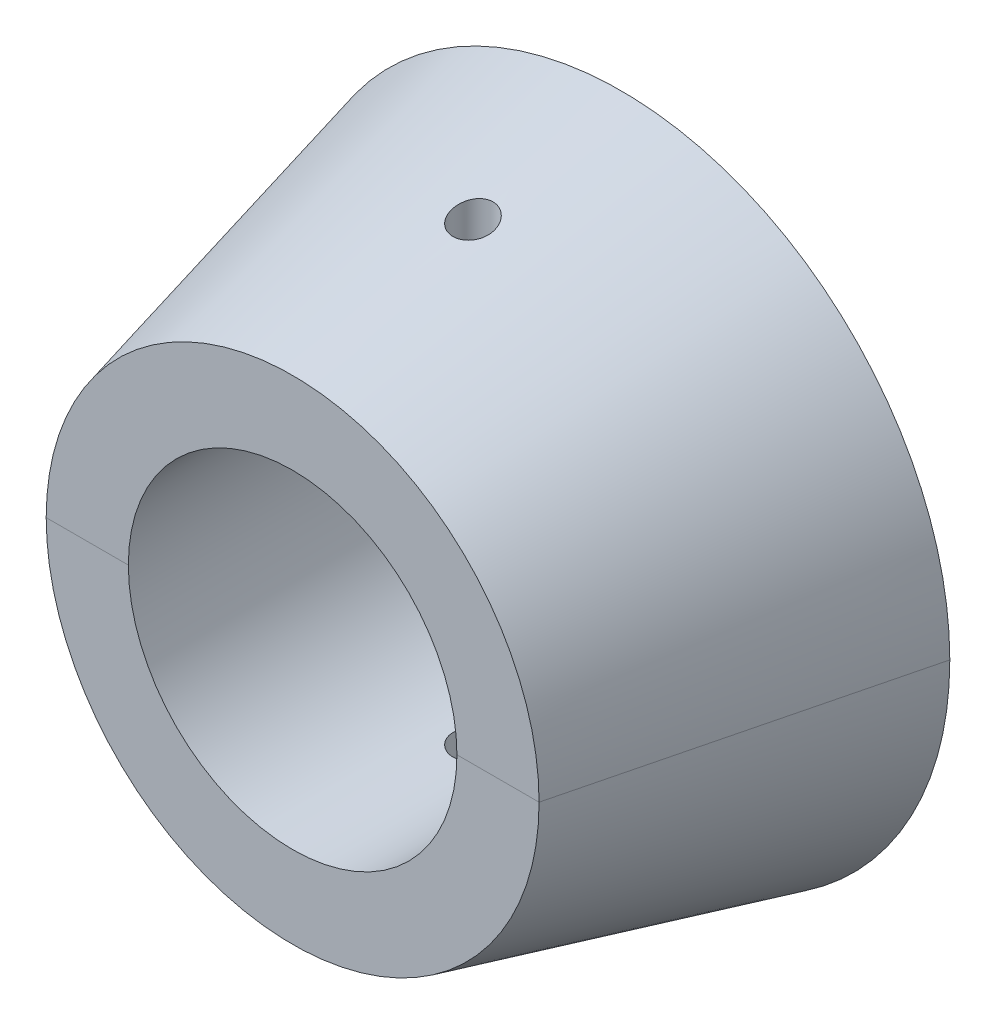
ISO-10303-21;
HEADER;
FILE_DESCRIPTION(('STEP AP214'),'2;1');
FILE_NAME('part.step','',(''),(''),'','','');
FILE_SCHEMA(('AUTOMOTIVE_DESIGN { 1 0 10303 214 1 1 1 1 }'));
ENDSEC;
DATA;
#1=APPLICATION_CONTEXT('core data for automotive mechanical design processes');
#2=APPLICATION_PROTOCOL_DEFINITION('international standard','automotive_design',2000,#1);
#3=PRODUCT_CONTEXT('',#1,'mechanical');
#4=PRODUCT('Part','Part','',(#3));
#5=PRODUCT_RELATED_PRODUCT_CATEGORY('part','',(#4));
#6=PRODUCT_DEFINITION_FORMATION('','',#4);
#7=PRODUCT_DEFINITION_CONTEXT('part definition',#1,'design');
#8=PRODUCT_DEFINITION('design','',#6,#7);
#9=PRODUCT_DEFINITION_SHAPE('','',#8);
#10=(LENGTH_UNIT() NAMED_UNIT(*) SI_UNIT(.MILLI.,.METRE.));
#11=(NAMED_UNIT(*) PLANE_ANGLE_UNIT() SI_UNIT($,.RADIAN.));
#12=(NAMED_UNIT(*) SI_UNIT($,.STERADIAN.) SOLID_ANGLE_UNIT());
#13=UNCERTAINTY_MEASURE_WITH_UNIT(LENGTH_MEASURE(1.E-05),#10,'distance_accuracy_value','');
#14=(GEOMETRIC_REPRESENTATION_CONTEXT(3) GLOBAL_UNCERTAINTY_ASSIGNED_CONTEXT((#13)) GLOBAL_UNIT_ASSIGNED_CONTEXT((#10,
#11,#12)) REPRESENTATION_CONTEXT('',''));
#15=CARTESIAN_POINT('',(0.,0.,0.));
#16=DIRECTION('',(0.,0.,1.));
#17=DIRECTION('',(1.,0.,0.));
#18=AXIS2_PLACEMENT_3D('',#15,#16,#17);
#19=CARTESIAN_POINT('',(0.,0.,5.));
#20=DIRECTION('',(0.,0.,-1.));
#21=DIRECTION('',(-1.,0.,0.));
#22=AXIS2_PLACEMENT_3D('',#19,#20,#21);
#23=CONICAL_SURFACE('',#22,20.,0.244978663126864);
#24=DIRECTION('',(-0.242535625036333,0.,0.970142500145332));
#25=VECTOR('',#24,1.);
#26=CARTESIAN_POINT('',(15.,0.,25.));
#27=LINE('',#26,#25);
#28=CARTESIAN_POINT('',(20.,0.,5.));
#29=VERTEX_POINT('',#28);
#30=CARTESIAN_POINT('',(15.,0.,25.));
#31=VERTEX_POINT('',#30);
#32=EDGE_CURVE('E159',#29,#31,#27,.T.);
#33=ORIENTED_EDGE('',*,*,#32,.T.);
#34=CARTESIAN_POINT('',(0.,0.,25.));
#35=DIRECTION('',(0.,0.,-1.));
#36=DIRECTION('',(1.,0.,0.));
#37=AXIS2_PLACEMENT_3D('',#34,#35,#36);
#38=CIRCLE('',#37,15.);
#39=CARTESIAN_POINT('',(-15.,0.,25.));
#40=VERTEX_POINT('',#39);
#41=EDGE_CURVE('E170',#31,#40,#38,.T.);
#42=ORIENTED_EDGE('',*,*,#41,.T.);
#43=DIRECTION('',(0.242535625036333,0.,0.970142500145332));
#44=VECTOR('',#43,1.);
#45=CARTESIAN_POINT('',(-15.,0.,25.));
#46=LINE('',#45,#44);
#47=CARTESIAN_POINT('',(-20.,0.,5.));
#48=VERTEX_POINT('',#47);
#49=EDGE_CURVE('E153',#48,#40,#46,.T.);
#50=ORIENTED_EDGE('',*,*,#49,.F.);
#51=CARTESIAN_POINT('',(0.,0.,5.));
#52=DIRECTION('',(0.,0.,-1.));
#53=DIRECTION('',(1.,0.,0.));
#54=AXIS2_PLACEMENT_3D('',#51,#52,#53);
#55=CIRCLE('',#54,20.);
#56=EDGE_CURVE('E173',#29,#48,#55,.T.);
#57=ORIENTED_EDGE('',*,*,#56,.F.);
#58=EDGE_LOOP('',(#33,#42,#50,#57));
#59=FACE_BOUND('',#58,.T.);
#60=CARTESIAN_POINT('',(3.,-16.1021359416428,19.4831280498653));
#61=CARTESIAN_POINT('',(3.,-16.4192333907019,18.2361816384219));
#62=CARTESIAN_POINT('',(3.,-16.7360422821651,16.9891618842602));
#63=CARTESIAN_POINT('',(3.,-17.3691612629189,14.4949959113051));
#64=CARTESIAN_POINT('',(3.,-17.6854713522684,13.2478496925266));
#65=CARTESIAN_POINT('',(3.,-18.3176711061729,10.7534507580422));
#66=CARTESIAN_POINT('',(3.,-18.633560770742,9.50619804233979));
#67=CARTESIAN_POINT('',(3.,-19.2649766184185,7.0116004495142));
#68=CARTESIAN_POINT('',(3.,-19.5805028014831,5.76425557238019));
#69=CARTESIAN_POINT('',(3.,-19.8958756729426,4.51687195013467));
#70=B_SPLINE_CURVE_WITH_KNOTS('',3,(#60,#61,#62,#63,#64,#65,#66,#67,#68,#69),.UNSPECIFIED.,.F.,
.F.,(4,2,2,2,4),(0.,3.85990085893771,7.71980126178377,11.5797015359117,15.4396022651384),.UNSPECIFIED.);
#71=CARTESIAN_POINT('',(3.,-17.4946420369209,14.));
#72=VERTEX_POINT('',#71);
#73=CARTESIAN_POINT('',(3.,-18.5084440188796,10.));
#74=VERTEX_POINT('',#73);
#75=EDGE_CURVE('E54',#72,#74,#70,.T.);
#76=ORIENTED_EDGE('',*,*,#75,.T.);
#77=CARTESIAN_POINT('',(0.,0.,10.));
#78=DIRECTION('',(0.,0.,1.));
#79=DIRECTION('',(1.,0.,0.));
#80=AXIS2_PLACEMENT_3D('',#77,#78,#79);
#81=CIRCLE('',#80,18.75);
#82=CARTESIAN_POINT('',(-3.,-18.5084440188796,10.));
#83=VERTEX_POINT('',#82);
#84=EDGE_CURVE('E11',#74,#83,#81,.F.);
#85=ORIENTED_EDGE('',*,*,#84,.T.);
#86=CARTESIAN_POINT('',(-3.,-16.1021359416428,19.4831280498653));
#87=CARTESIAN_POINT('',(-3.,-16.4192333907019,18.2361816384219));
#88=CARTESIAN_POINT('',(-3.,-16.7360422821651,16.9891618842602));
#89=CARTESIAN_POINT('',(-3.,-17.3691612629189,14.4949959113051));
#90=CARTESIAN_POINT('',(-3.,-17.6854713522684,13.2478496925266));
#91=CARTESIAN_POINT('',(-3.,-18.3176711061729,10.7534507580422));
#92=CARTESIAN_POINT('',(-3.,-18.633560770742,9.50619804233979));
#93=CARTESIAN_POINT('',(-3.,-19.2649766184185,7.0116004495142));
#94=CARTESIAN_POINT('',(-3.,-19.5805028014831,5.76425557238019));
#95=CARTESIAN_POINT('',(-3.,-19.8958756729426,4.51687195013467));
#96=B_SPLINE_CURVE_WITH_KNOTS('',3,(#86,#87,#88,#89,#90,#91,#92,#93,#94,#95),.UNSPECIFIED.,.F.,
.F.,(4,2,2,2,4),(0.,3.85990085893771,7.71980126178377,11.5797015359117,15.4396022651384),.UNSPECIFIED.);
#97=CARTESIAN_POINT('',(-3.,-17.4946420369209,14.));
#98=VERTEX_POINT('',#97);
#99=EDGE_CURVE('E186',#98,#83,#96,.T.);
#100=ORIENTED_EDGE('',*,*,#99,.F.);
#101=CARTESIAN_POINT('',(2.99999999333333,-17.4946927678796,13.9998));
#102=CARTESIAN_POINT('',(3.00001279711659,-17.4735359007503,14.0831829455452));
#103=CARTESIAN_POINT('',(2.99653455992637,-17.4529483122174,14.1667134548675));
#104=CARTESIAN_POINT('',(2.98257770875621,-17.4130381706139,14.3335029744372));
#105=CARTESIAN_POINT('',(2.97209811079381,-17.3937157957776,14.416761944869));
#106=CARTESIAN_POINT('',(2.94411682366012,-17.3564640460793,14.5824381597243));
#107=CARTESIAN_POINT('',(2.92661342533385,-17.3385350115379,14.6648551942638));
#108=CARTESIAN_POINT('',(2.88465362207424,-17.3041698190952,14.82818710329));
#109=CARTESIAN_POINT('',(2.86019767830832,-17.2877335622723,14.9091020770303));
#110=CARTESIAN_POINT('',(2.77643827539865,-17.2407167423689,15.1489187172725));
#111=CARTESIAN_POINT('',(2.70675824188497,-17.212448082004,15.3048027718332));
#112=CARTESIAN_POINT('',(2.54150237880649,-17.1622430856381,15.6030762527477));
#113=CARTESIAN_POINT('',(2.4459431054906,-17.1403027195776,15.7454742284811));
#114=CARTESIAN_POINT('',(2.23374360507002,-17.1026431557132,16.0095950883432));
#115=CARTESIAN_POINT('',(2.11758514094337,-17.0868036398978,16.1316875461327));
#116=CARTESIAN_POINT('',(1.86613300621299,-17.0599407541634,16.3549581639264));
#117=CARTESIAN_POINT('',(1.73083488704488,-17.0489185063479,16.4561314482634));
#118=CARTESIAN_POINT('',(1.44607214709479,-17.0308471361942,16.6337863537862));
#119=CARTESIAN_POINT('',(1.29672034021567,-17.0237690813711,16.7104459744356));
#120=CARTESIAN_POINT('',(0.987253600557638,-17.0126140429135,16.8378387188639));
#121=CARTESIAN_POINT('',(0.827139589234769,-17.0085368027067,16.8885740590789));
#122=CARTESIAN_POINT('',(0.500201315853449,-17.0027376079651,16.9627647911149));
#123=CARTESIAN_POINT('',(0.333359618807539,-17.0010222399556,16.9861438677255));
#124=CARTESIAN_POINT('',(-0.00189929949557036,-16.9996527776667,17.0046936410731));
#125=CARTESIAN_POINT('',(-0.170316590075093,-16.9999987745122,16.9998630907716));
#126=CARTESIAN_POINT('',(-0.504275105234779,-17.0028210341021,16.9620934791756));
#127=CARTESIAN_POINT('',(-0.669810304429715,-17.0053013145494,16.9291014058914));
#128=CARTESIAN_POINT('',(-0.992968954756832,-17.0128365697864,16.8358934020196));
#129=CARTESIAN_POINT('',(-1.15059247557365,-17.0178915218945,16.7756777112594));
#130=CARTESIAN_POINT('',(-1.45331249866972,-17.031306347258,16.6298452887929));
#131=CARTESIAN_POINT('',(-1.5984187356006,-17.039663623555,16.5442485300104));
#132=CARTESIAN_POINT('',(-1.8720903488782,-17.0605773801568,16.3501938994265));
#133=CARTESIAN_POINT('',(-2.00065688527329,-17.0731335657392,16.2417376323363));
#134=CARTESIAN_POINT('',(-2.23723642829095,-17.1032725057092,16.0056451548437));
#135=CARTESIAN_POINT('',(-2.34531426120821,-17.1208389503236,15.8780718051566));
#136=CARTESIAN_POINT('',(-2.53850933328437,-17.161679002917,15.6073646232921));
#137=CARTESIAN_POINT('',(-2.62362262486272,-17.1849535908086,15.4642281217506));
#138=CARTESIAN_POINT('',(-2.76886825699937,-17.2375264379893,15.1665592572302));
#139=CARTESIAN_POINT('',(-2.8289586114624,-17.2668346990851,15.0120082491614));
#140=CARTESIAN_POINT('',(-2.92269820999203,-17.3312536326943,14.6963371189795));
#141=CARTESIAN_POINT('',(-2.9563731739004,-17.3663586206894,14.535223547859));
#142=CARTESIAN_POINT('',(-2.98449076993952,-17.4184010077625,14.3110612531239));
#143=CARTESIAN_POINT('',(-2.99032169956197,-17.4332016225596,14.2487690081099));
#144=CARTESIAN_POINT('',(-2.99807286954106,-17.4634606756375,14.1242330567297));
#145=CARTESIAN_POINT('',(-3.00000091013688,-17.478917738666,14.0619895025679));
#146=CARTESIAN_POINT('',(-2.99999999333333,-17.4946927678796,13.9998));
#147=B_SPLINE_CURVE_WITH_KNOTS('',3,(#101,#102,#103,#104,#105,#106,#107,#108,#109,#110,#111,
#112,#113,#114,#115,#116,#117,#118,#119,#120,#121,#122,#123,#124,#125,#126,#127,#128,#129,#130,
#131,#132,#133,#134,#135,#136,#137,#138,#139,#140,#141,#142,#143,#144,#145,#146),.UNSPECIFIED.,
.F.,.F.,(4,2,2,2,2,2,2,2,2,2,2,2,2,2,2,2,2,2,2,2,2,2,4),(0.,0.258005795822083,0.516047859821525,
0.774152753280812,1.03224053044678,1.54869078274918,2.06481141322169,2.57015685989687,
3.07561995585485,3.57732472161101,4.07898658616991,4.58204461509004,5.08512488243116,
5.58915425502491,6.09317918743925,6.59680853935065,7.10040254882668,7.60237557384776,
8.1044348326091,8.60733313710006,9.10974117530115,9.30252128310684,9.49491572237081),.UNSPECIFIED.);
#148=EDGE_CURVE('E197',#72,#98,#147,.T.);
#149=ORIENTED_EDGE('',*,*,#148,.F.);
#150=EDGE_LOOP('',(#76,#85,#100,#149));
#151=FACE_BOUND('',#150,.T.);
#152=ADVANCED_FACE('F40',(#59,#151),#23,.T.);
#153=CARTESIAN_POINT('',(0.,0.,5.));
#154=DIRECTION('',(0.,0.,-1.));
#155=DIRECTION('',(-1.,0.,0.));
#156=AXIS2_PLACEMENT_3D('',#153,#154,#155);
#157=CYLINDRICAL_SURFACE('',#156,12.5);
#158=CARTESIAN_POINT('',(0.,0.,5.));
#159=DIRECTION('',(0.,0.,1.));
#160=DIRECTION('',(1.,0.,0.));
#161=AXIS2_PLACEMENT_3D('',#158,#159,#160);
#162=CIRCLE('',#161,12.5);
#163=CARTESIAN_POINT('',(12.5,0.,5.));
#164=VERTEX_POINT('',#163);
#165=CARTESIAN_POINT('',(-12.5,0.,5.));
#166=VERTEX_POINT('',#165);
#167=EDGE_CURVE('E183',#164,#166,#162,.T.);
#168=ORIENTED_EDGE('',*,*,#167,.F.);
#169=EDGE_CURVE('E187',#166,#164,#162,.T.);
#170=ORIENTED_EDGE('',*,*,#169,.F.);
#171=EDGE_LOOP('',(#168,#170));
#172=FACE_BOUND('',#171,.T.);
#173=CARTESIAN_POINT('',(0.,0.,0.));
#174=DIRECTION('',(0.,0.,1.));
#175=DIRECTION('',(1.,0.,0.));
#176=AXIS2_PLACEMENT_3D('',#173,#174,#175);
#177=CIRCLE('',#176,12.5);
#178=CARTESIAN_POINT('',(12.5,0.,0.));
#179=VERTEX_POINT('',#178);
#180=EDGE_CURVE('E172',#179,#179,#177,.T.);
#181=ORIENTED_EDGE('',*,*,#180,.T.);
#182=EDGE_LOOP('',(#181));
#183=FACE_BOUND('',#182,.T.);
#184=ADVANCED_FACE('F42',(#172,#183),#157,.T.);
#185=CARTESIAN_POINT('',(0.,0.,0.));
#186=DIRECTION('',(0.,0.,1.));
#187=DIRECTION('',(1.,0.,0.));
#188=AXIS2_PLACEMENT_3D('',#185,#186,#187);
#189=PLANE('',#188);
#190=ORIENTED_EDGE('',*,*,#180,.F.);
#191=EDGE_LOOP('',(#190));
#192=FACE_BOUND('',#191,.T.);
#193=ADVANCED_FACE('F253',(#192),#189,.F.);
#194=CARTESIAN_POINT('',(0.,0.,5.));
#195=DIRECTION('',(0.,0.,-1.));
#196=DIRECTION('',(-1.,0.,0.));
#197=AXIS2_PLACEMENT_3D('',#194,#195,#196);
#198=PLANE('',#197);
#199=DIRECTION('',(-1.,0.,0.));
#200=VECTOR('',#199,1.);
#201=CARTESIAN_POINT('',(0.,0.,5.));
#202=LINE('',#201,#200);
#203=EDGE_CURVE('E169',#166,#48,#202,.T.);
#204=ORIENTED_EDGE('',*,*,#203,.F.);
#205=ORIENTED_EDGE('',*,*,#169,.T.);
#206=DIRECTION('',(1.,0.,0.));
#207=VECTOR('',#206,1.);
#208=CARTESIAN_POINT('',(0.,0.,5.));
#209=LINE('',#208,#207);
#210=EDGE_CURVE('E176',#164,#29,#209,.T.);
#211=ORIENTED_EDGE('',*,*,#210,.T.);
#212=ORIENTED_EDGE('',*,*,#56,.T.);
#213=EDGE_LOOP('',(#204,#205,#211,#212));
#214=FACE_BOUND('',#213,.T.);
#215=ADVANCED_FACE('F271',(#214),#198,.T.);
#216=CARTESIAN_POINT('',(0.,0.,5.));
#217=DIRECTION('',(0.,0.,-1.));
#218=DIRECTION('',(-1.,0.,0.));
#219=AXIS2_PLACEMENT_3D('',#216,#217,#218);
#220=PLANE('',#219);
#221=ORIENTED_EDGE('',*,*,#210,.F.);
#222=ORIENTED_EDGE('',*,*,#167,.T.);
#223=ORIENTED_EDGE('',*,*,#203,.T.);
#224=CARTESIAN_POINT('',(0.,0.,5.));
#225=DIRECTION('',(0.,0.,-1.));
#226=DIRECTION('',(-1.,0.,0.));
#227=AXIS2_PLACEMENT_3D('',#224,#225,#226);
#228=CIRCLE('',#227,20.);
#229=EDGE_CURVE('E163',#48,#29,#228,.T.);
#230=ORIENTED_EDGE('',*,*,#229,.T.);
#231=EDGE_LOOP('',(#221,#222,#223,#230));
#232=FACE_BOUND('',#231,.T.);
#233=ADVANCED_FACE('F267',(#232),#220,.T.);
#234=CARTESIAN_POINT('',(0.,0.,25.));
#235=DIRECTION('',(0.,0.,1.));
#236=DIRECTION('',(1.,0.,0.));
#237=AXIS2_PLACEMENT_3D('',#234,#235,#236);
#238=PLANE('',#237);
#239=CARTESIAN_POINT('',(0.,0.,25.));
#240=DIRECTION('',(0.,0.,1.));
#241=DIRECTION('',(1.,0.,0.));
#242=AXIS2_PLACEMENT_3D('',#239,#240,#241);
#243=CIRCLE('',#242,10.);
#244=CARTESIAN_POINT('',(-10.,0.,25.));
#245=VERTEX_POINT('',#244);
#246=CARTESIAN_POINT('',(10.,0.,25.));
#247=VERTEX_POINT('',#246);
#248=EDGE_CURVE('E69',#245,#247,#243,.T.);
#249=ORIENTED_EDGE('',*,*,#248,.F.);
#250=DIRECTION('',(1.,0.,0.));
#251=VECTOR('',#250,1.);
#252=CARTESIAN_POINT('',(0.,0.,25.));
#253=LINE('',#252,#251);
#254=EDGE_CURVE('E158',#40,#245,#253,.T.);
#255=ORIENTED_EDGE('',*,*,#254,.F.);
#256=ORIENTED_EDGE('',*,*,#41,.F.);
#257=DIRECTION('',(-1.,0.,0.));
#258=VECTOR('',#257,1.);
#259=CARTESIAN_POINT('',(0.,0.,25.));
#260=LINE('',#259,#258);
#261=EDGE_CURVE('E166',#31,#247,#260,.T.);
#262=ORIENTED_EDGE('',*,*,#261,.T.);
#263=EDGE_LOOP('',(#249,#255,#256,#262));
#264=FACE_BOUND('',#263,.T.);
#265=ADVANCED_FACE('F283',(#264),#238,.T.);
#266=CARTESIAN_POINT('',(0.,0.,25.));
#267=DIRECTION('',(0.,0.,1.));
#268=DIRECTION('',(1.,0.,0.));
#269=AXIS2_PLACEMENT_3D('',#266,#267,#268);
#270=PLANE('',#269);
#271=EDGE_CURVE('E154',#247,#245,#243,.T.);
#272=ORIENTED_EDGE('',*,*,#271,.F.);
#273=ORIENTED_EDGE('',*,*,#261,.F.);
#274=CARTESIAN_POINT('',(0.,0.,25.));
#275=DIRECTION('',(0.,0.,-1.));
#276=DIRECTION('',(-1.,0.,0.));
#277=AXIS2_PLACEMENT_3D('',#274,#275,#276);
#278=CIRCLE('',#277,15.);
#279=EDGE_CURVE('E162',#40,#31,#278,.T.);
#280=ORIENTED_EDGE('',*,*,#279,.F.);
#281=ORIENTED_EDGE('',*,*,#254,.T.);
#282=EDGE_LOOP('',(#272,#273,#280,#281));
#283=FACE_BOUND('',#282,.T.);
#284=ADVANCED_FACE('F285',(#283),#270,.T.);
#285=CARTESIAN_POINT('',(0.,0.,5.));
#286=DIRECTION('',(0.,0.,-1.));
#287=DIRECTION('',(-1.,0.,0.));
#288=AXIS2_PLACEMENT_3D('',#285,#286,#287);
#289=CONICAL_SURFACE('',#288,20.,0.244978663126864);
#290=CARTESIAN_POINT('',(-0.830306972545519,17.5012857830732,14.9161172617317));
#291=CARTESIAN_POINT('',(-0.780973738090765,17.4921437068957,14.961995104217));
#292=CARTESIAN_POINT('',(-0.727700477505956,17.4839795478718,15.0038936040205));
#293=CARTESIAN_POINT('',(-0.614717464013609,17.469675762127,15.0784102770681));
#294=CARTESIAN_POINT('',(-0.55500157737007,17.463538087705,15.1110194969694));
#295=CARTESIAN_POINT('',(-0.430825333135551,17.4533162651582,15.1659073850034));
#296=CARTESIAN_POINT('',(-0.366364950625651,17.4492321278197,15.1881859988735));
#297=CARTESIAN_POINT('',(-0.234554992627351,17.4431215596647,15.2217025674519));
#298=CARTESIAN_POINT('',(-0.167206015222059,17.4410947050113,15.2329427962486));
#299=CARTESIAN_POINT('',(-0.0319861072156037,17.4391004862833,15.2440013951828));
#300=CARTESIAN_POINT('',(0.0358786350370011,17.4391198937942,15.2438931296447));
#301=CARTESIAN_POINT('',(0.170622281739919,17.4411853332979,15.23244089996));
#302=CARTESIAN_POINT('',(0.237501183148745,17.4432313715419,15.2210969011567));
#303=CARTESIAN_POINT('',(0.36824242310201,17.4493469090003,15.1875598499512));
#304=CARTESIAN_POINT('',(0.432110406290895,17.4534124424072,15.1653880621813));
#305=CARTESIAN_POINT('',(0.55518073368772,17.4635625555977,15.1108910136982));
#306=CARTESIAN_POINT('',(0.614383056387519,17.4696471446882,15.078565706182));
#307=CARTESIAN_POINT('',(0.72677696485652,17.4838490471633,15.0045671987958));
#308=CARTESIAN_POINT('',(0.779937215994656,17.4919763125694,14.9628483398452));
#309=CARTESIAN_POINT('',(0.878481901959143,17.5101890534266,14.8714249349806));
#310=CARTESIAN_POINT('',(0.923865987900925,17.5202746166952,14.8217200309592));
#311=CARTESIAN_POINT('',(1.00623465077403,17.5424347814597,14.7151102254657));
#312=CARTESIAN_POINT('',(1.04310254335696,17.5545335036868,14.6581202346824));
#313=CARTESIAN_POINT('',(1.10678220582091,17.5804393344998,14.5391342938775));
#314=CARTESIAN_POINT('',(1.13359296936963,17.5942466138628,14.4771378436555));
#315=CARTESIAN_POINT('',(1.17703596802197,17.6236197717065,14.3485234969033));
#316=CARTESIAN_POINT('',(1.19343827875254,17.6392169430438,14.2818351236346));
#317=CARTESIAN_POINT('',(1.21484296384876,17.6715625576384,14.1469266966099));
#318=CARTESIAN_POINT('',(1.219843750392,17.6883111609142,14.0787064308521));
#319=CARTESIAN_POINT('',(1.21840605879542,17.7229504908516,13.9408716023035));
#320=CARTESIAN_POINT('',(1.21168026489382,17.7408592556311,13.87126451228));
#321=CARTESIAN_POINT('',(1.18647879109382,17.7768890762604,13.7342629307832));
#322=CARTESIAN_POINT('',(1.16800161885901,17.7950101587862,13.6668687214725));
#323=CARTESIAN_POINT('',(1.1194082192632,17.8311393092142,13.5351049831844));
#324=CARTESIAN_POINT('',(1.08911593511705,17.8491412662759,13.4707985700706));
#325=CARTESIAN_POINT('',(1.01766968273939,17.8840575945608,13.3481945070601));
#326=CARTESIAN_POINT('',(0.976515639996875,17.9009719583222,13.2898968983872));
#327=CARTESIAN_POINT('',(0.884782851865319,17.9328554840982,13.1815626099723));
#328=CARTESIAN_POINT('',(0.834290671115974,17.9478405254681,13.1314574349213));
#329=CARTESIAN_POINT('',(0.724958431578677,17.9753397315569,13.0405265161295));
#330=CARTESIAN_POINT('',(0.66612012278687,17.9878544129426,12.9996988317642));
#331=CARTESIAN_POINT('',(0.543986995817398,18.009373484897,12.9300532881849));
#332=CARTESIAN_POINT('',(0.48092684782721,18.0184874193771,12.9008580997013));
#333=CARTESIAN_POINT('',(0.350411338773348,18.0333320333431,12.8535286415418));
#334=CARTESIAN_POINT('',(0.28295728808103,18.0390637164179,12.8353910907669));
#335=CARTESIAN_POINT('',(0.148684184306048,18.0466548886127,12.8114091200164));
#336=CARTESIAN_POINT('',(0.0819617287495341,18.0486697464663,12.8050713396772));
#337=CARTESIAN_POINT('',(-0.0516290287332172,18.0491969065233,12.8034110718481));
#338=CARTESIAN_POINT('',(-0.118497307265318,18.0477097344009,12.8080869311496));
#339=CARTESIAN_POINT('',(-0.24903650409061,18.0413810394094,12.8280642802499));
#340=CARTESIAN_POINT('',(-0.312744929533863,18.0366093851658,12.8431444610313));
#341=CARTESIAN_POINT('',(-0.436662148926858,18.0240270745614,12.8831649173648));
#342=CARTESIAN_POINT('',(-0.496870783638422,18.016216280046,12.9081056411629));
#343=CARTESIAN_POINT('',(-0.613099339817582,17.9977894199462,12.9674681508761));
#344=CARTESIAN_POINT('',(-0.669043272034053,17.9871331994274,13.0020259748207));
#345=CARTESIAN_POINT('',(-0.774367543817384,17.963550926548,13.0793790400751));
#346=CARTESIAN_POINT('',(-0.823746697100382,17.9506244649219,13.1221757667788));
#347=CARTESIAN_POINT('',(-0.916626974465982,17.9224834956699,13.2166243703925));
#348=CARTESIAN_POINT('',(-0.959819129330162,17.9071988120149,13.2685591083624));
#349=CARTESIAN_POINT('',(-1.03692588270687,17.8753528660678,13.3785618701374));
#350=CARTESIAN_POINT('',(-1.07083851134068,17.8587913336783,13.4366311925852));
#351=CARTESIAN_POINT('',(-1.12977455629824,17.8243144885764,13.5597751610735));
#352=CARTESIAN_POINT('',(-1.15439317826217,17.8063715387667,13.6250360729438));
#353=CARTESIAN_POINT('',(-1.19217236493631,17.7703746002054,13.7587664918351));
#354=CARTESIAN_POINT('',(-1.20533187511903,17.7523206013884,13.827236293544));
#355=CARTESIAN_POINT('',(-1.21994212399064,17.7163525621845,13.9667874704229));
#356=CARTESIAN_POINT('',(-1.22117796573453,17.6984468824664,14.037893668192));
#357=CARTESIAN_POINT('',(-1.21123926377966,17.6636434395946,14.1795073699467));
#358=CARTESIAN_POINT('',(-1.20006210173047,17.6467458898843,14.2500147444571));
#359=CARTESIAN_POINT('',(-1.16561716690529,17.614547129245,14.3877428437838));
#360=CARTESIAN_POINT('',(-1.14244970374135,17.5992339199396,14.4549858501674));
#361=CARTESIAN_POINT('',(-1.08461130913339,17.5704076060594,14.5846801118211));
#362=CARTESIAN_POINT('',(-1.04995535460969,17.5568921897762,14.6471374760425));
#363=CARTESIAN_POINT('',(-0.98425719065229,17.5363366950709,14.74432589921));
#364=CARTESIAN_POINT('',(-0.95628375510938,17.5286987986449,14.7810411454028));
#365=CARTESIAN_POINT('',(-0.896262940776232,17.5143152093154,14.851169955959));
#366=CARTESIAN_POINT('',(-0.864215661388972,17.5075694946505,14.884583600847));
#367=CARTESIAN_POINT('',(-0.830306972545519,17.5012857830732,14.9161172617317));
#368=B_SPLINE_CURVE_WITH_KNOTS('',3,(#290,#291,#292,#293,#294,#295,#296,#297,#298,#299,#300,
#301,#302,#303,#304,#305,#306,#307,#308,#309,#310,#311,#312,#313,#314,#315,#316,#317,#318,#319,
#320,#321,#322,#323,#324,#325,#326,#327,#328,#329,#330,#331,#332,#333,#334,#335,#336,#337,#338,
#339,#340,#341,#342,#343,#344,#345,#346,#347,#348,#349,#350,#351,#352,#353,#354,#355,#356,#357,
#358,#359,#360,#361,#362,#363,#364,#365,#366,#367),.UNSPECIFIED.,.T.,.F.,(4,2,2,2,2,2,2,2,2,2,2,
2,2,2,2,2,2,2,2,2,2,2,2,2,2,2,2,2,2,2,2,2,2,2,2,2,2,2,4),(0.,0.203791010380522,
0.407777782389622,0.611765625849287,0.815711435646105,1.01833888395656,1.22096695727638,
1.42319868112041,1.62543133717415,1.82866905636654,2.03191589161366,2.2378011337602,
2.44370697161914,2.65401602384988,2.86435436278202,3.07991892442465,3.29551086660831,
3.51444624842193,3.73338313215779,3.95038387500635,4.16733918473207,4.37653456262903,
4.58566783637104,4.78584164858996,4.98598541551741,5.18199814029792,5.37801977655896,
5.5769690296301,5.77595418496477,5.98279402864851,6.18967774675564,6.40474693020804,
6.6198359033623,6.83879427771827,7.05779884707051,7.27500017337784,7.49191945241723,
7.63199651448737,7.77207015929215),.UNSPECIFIED.);
#369=CARTESIAN_POINT('',(-0.830306972545519,17.5012857830732,14.9161172617317));
#370=VERTEX_POINT('',#369);
#371=EDGE_CURVE('E134',#370,#370,#368,.T.);
#372=ORIENTED_EDGE('',*,*,#371,.F.);
#373=EDGE_LOOP('',(#372));
#374=FACE_BOUND('',#373,.T.);
#375=ORIENTED_EDGE('',*,*,#279,.T.);
#376=ORIENTED_EDGE('',*,*,#32,.F.);
#377=ORIENTED_EDGE('',*,*,#229,.F.);
#378=ORIENTED_EDGE('',*,*,#49,.T.);
#379=EDGE_LOOP('',(#375,#376,#377,#378));
#380=FACE_BOUND('',#379,.T.);
#381=ADVANCED_FACE('F264',(#374,#380),#289,.T.);
#382=CARTESIAN_POINT('',(0.,0.,5.));
#383=DIRECTION('',(0.,0.,1.));
#384=DIRECTION('',(1.,0.,0.));
#385=AXIS2_PLACEMENT_3D('',#382,#383,#384);
#386=CYLINDRICAL_SURFACE('',#385,10.);
#387=CARTESIAN_POINT('',(0.,10.,12.804146870566));
#388=CARTESIAN_POINT('',(-0.0682115122565086,9.99999906767572,12.8041497766926));
#389=CARTESIAN_POINT('',(-0.136465983552259,9.99929470147023,12.8098905898904));
#390=CARTESIAN_POINT('',(-0.271076584169681,9.99655259445628,12.8327017327094));
#391=CARTESIAN_POINT('',(-0.337430639877372,9.99451345105148,12.8497839802857));
#392=CARTESIAN_POINT('',(-0.466272084226123,9.98933157266332,12.8947680415991));
#393=CARTESIAN_POINT('',(-0.528762007787722,9.98618957040023,12.9226626730564));
#394=CARTESIAN_POINT('',(-0.648161395586846,9.9791516814015,12.9884641966383));
#395=CARTESIAN_POINT('',(-0.70507183515772,9.9752559267824,13.0263693345609));
#396=CARTESIAN_POINT('',(-0.812007577374275,9.96712282210606,13.1113286718508));
#397=CARTESIAN_POINT('',(-0.861999385981963,9.96288395767521,13.1584248883944));
#398=CARTESIAN_POINT('',(-0.953390393925902,9.95455463146217,13.2603393373615));
#399=CARTESIAN_POINT('',(-0.994789161035874,9.95046417715347,13.3151579579859));
#400=CARTESIAN_POINT('',(-1.06794294527944,9.9428798429979,13.4311778081046));
#401=CARTESIAN_POINT('',(-1.09966671287046,9.93938791191476,13.4923988796749));
#402=CARTESIAN_POINT('',(-1.15237041617939,9.93341583529684,13.6193492323363));
#403=CARTESIAN_POINT('',(-1.17335073992096,9.93093565322113,13.685078350512));
#404=CARTESIAN_POINT('',(-1.20387052025593,9.92728226937734,13.8188320474994));
#405=CARTESIAN_POINT('',(-1.21346641743951,9.92610262202451,13.8868435686454));
#406=CARTESIAN_POINT('',(-1.22111957502136,9.92516411477031,14.0235211391186));
#407=CARTESIAN_POINT('',(-1.21917727761823,9.92540520041966,14.0921871632614));
#408=CARTESIAN_POINT('',(-1.20385553629307,9.9272750217403,14.2278317994416));
#409=CARTESIAN_POINT('',(-1.1905381897695,9.92889622307742,14.2948175442886));
#410=CARTESIAN_POINT('',(-1.15294123212764,9.9333318545139,14.4255962864616));
#411=CARTESIAN_POINT('',(-1.12866140880115,9.9361463077118,14.4893892219556));
#412=CARTESIAN_POINT('',(-1.06976172544034,9.94265988646306,14.6121648491535));
#413=CARTESIAN_POINT('',(-1.03511480440137,9.94636132218878,14.6711344312069));
#414=CARTESIAN_POINT('',(-0.956483794377374,9.95423000130291,14.7824457948199));
#415=CARTESIAN_POINT('',(-0.912499299013303,9.95839726496079,14.8347872877611));
#416=CARTESIAN_POINT('',(-0.816097190472717,9.96676156010803,14.9317171795295));
#417=CARTESIAN_POINT('',(-0.76362603841425,9.970958607191,14.9762523469497));
#418=CARTESIAN_POINT('',(-0.651924631538354,9.97888390604085,15.0558911822145));
#419=CARTESIAN_POINT('',(-0.592694362398976,9.98261215681435,15.0909948300739));
#420=CARTESIAN_POINT('',(-0.46911556266885,9.98918194588374,15.1507739082522));
#421=CARTESIAN_POINT('',(-0.404765445489793,9.99202320795735,15.1754460908941));
#422=CARTESIAN_POINT('',(-0.272793423987252,9.99649634651058,15.2136200669206));
#423=CARTESIAN_POINT('',(-0.205171665480564,9.99812827683721,15.2271223576619));
#424=CARTESIAN_POINT('',(-0.0690362557368922,9.99999189017402,15.2425044747832));
#425=CARTESIAN_POINT('',(-0.000531008105302534,10.0002324095134,15.24445764704));
#426=CARTESIAN_POINT('',(0.135830476689683,9.99930993659574,15.2368795205113));
#427=CARTESIAN_POINT('',(0.203686726959067,9.99814697274148,15.2273484541367));
#428=CARTESIAN_POINT('',(0.336608244548161,9.99455372948367,15.1971333235934));
#429=CARTESIAN_POINT('',(0.401681558614704,9.99212741511309,15.1764841468098));
#430=CARTESIAN_POINT('',(0.527441539461071,9.98627918475915,15.1246551644452));
#431=CARTESIAN_POINT('',(0.588128063848335,9.9828572364762,15.0934750172213));
#432=CARTESIAN_POINT('',(0.703719913226147,9.97537737811446,15.0212911298111));
#433=CARTESIAN_POINT('',(0.758595347142165,9.97131642396025,14.9802398442806));
#434=CARTESIAN_POINT('',(0.860703398305026,9.96302258127755,14.88954636105));
#435=CARTESIAN_POINT('',(0.907935727333124,9.95878968627276,14.8399038395235));
#436=CARTESIAN_POINT('',(0.993676299203285,9.95060186174156,14.7331143734744));
#437=CARTESIAN_POINT('',(1.03213598660622,9.94664855904643,14.6759283012745));
#438=CARTESIAN_POINT('',(1.09890432880094,9.93949403269687,14.5558653234623));
#439=CARTESIAN_POINT('',(1.12721317868125,9.93629279458896,14.4929885272489));
#440=CARTESIAN_POINT('',(1.17279728904694,9.93101582618255,14.3634869370176));
#441=CARTESIAN_POINT('',(1.19010012905877,9.92893728455261,14.2968719703234));
#442=CARTESIAN_POINT('',(1.21326996654998,9.92613290401639,14.1616551637889));
#443=CARTESIAN_POINT('',(1.21913746809516,9.92540700548613,14.0930534116607));
#444=CARTESIAN_POINT('',(1.21926112979612,9.92539177649997,13.9562933764734));
#445=CARTESIAN_POINT('',(1.21359356967711,9.92609300863007,13.8881351508281));
#446=CARTESIAN_POINT('',(1.19096930506189,9.9288327628049,13.7537475956068));
#447=CARTESIAN_POINT('',(1.17401259756957,9.93087128520455,13.6875182665428));
#448=CARTESIAN_POINT('',(1.1293148617126,9.93605305193856,13.5588772954059));
#449=CARTESIAN_POINT('',(1.10157731883218,9.93919593919619,13.4964644269971));
#450=CARTESIAN_POINT('',(1.03611280621601,9.94623292055076,13.3771668736491));
#451=CARTESIAN_POINT('',(0.998385735447365,9.95012702224529,13.3202822446297));
#452=CARTESIAN_POINT('',(0.913729540059365,9.95825852709921,13.2132657927988));
#453=CARTESIAN_POINT('',(0.866743546488638,9.96249795175977,13.1631791073261));
#454=CARTESIAN_POINT('',(0.76502139176351,9.97082448038232,13.0715715479793));
#455=CARTESIAN_POINT('',(0.710283402374244,9.97491154812433,13.0300527004406));
#456=CARTESIAN_POINT('',(0.594384629805861,9.98248911807081,12.9566323128331));
#457=CARTESIAN_POINT('',(0.533201292511704,9.98597740497678,12.9247661659105));
#458=CARTESIAN_POINT('',(0.406344128158709,9.99194176694381,12.8718055831784));
#459=CARTESIAN_POINT('',(0.340675294742186,9.99441894688847,12.8506993831582));
#460=CARTESIAN_POINT('',(0.228885202896096,9.99748140142712,12.8249385874884));
#461=CARTESIAN_POINT('',(0.183470292969078,9.99842130139847,12.8171528238442));
#462=CARTESIAN_POINT('',(0.0920434404947691,9.99968091313057,12.8067560026341));
#463=CARTESIAN_POINT('',(0.0460315020636639,10.0000006291649,12.8041449094106));
#464=CARTESIAN_POINT('',(0.,10.,12.804146870566));
#465=B_SPLINE_CURVE_WITH_KNOTS('',3,(#387,#388,#389,#390,#391,#392,#393,#394,#395,#396,#397,
#398,#399,#400,#401,#402,#403,#404,#405,#406,#407,#408,#409,#410,#411,#412,#413,#414,#415,#416,
#417,#418,#419,#420,#421,#422,#423,#424,#425,#426,#427,#428,#429,#430,#431,#432,#433,#434,#435,
#436,#437,#438,#439,#440,#441,#442,#443,#444,#445,#446,#447,#448,#449,#450,#451,#452,#453,#454,
#455,#456,#457,#458,#459,#460,#461,#462,#463,#464),.UNSPECIFIED.,.T.,.F.,(4,2,2,2,2,2,2,2,2,2,2,
2,2,2,2,2,2,2,2,2,2,2,2,2,2,2,2,2,2,2,2,2,2,2,2,2,2,2,4),(0.,0.204466404939661,
0.409148010743974,0.613693886239135,0.818203941671976,1.02367179676168,1.2291499842927,
1.4352849890555,1.64141254826338,1.8465138603075,2.05160731194273,2.25558824408961,
2.45957312500488,2.66409517825929,2.8686261343098,3.07450168895597,3.28037767984172,
3.48631771995024,3.69224858976785,3.89687022184253,4.10148771298326,4.30546684768565,
4.50945260045804,4.71444127779958,4.91943768339023,5.12554258084802,5.33164351697206,
5.53722593686686,5.74279929455435,5.94701764220916,6.15123604406283,6.35538847619343,
6.55954297317656,6.76499284857542,6.97049125832378,7.17673428535281,7.38275133374776,
7.52073332953514,7.65871437451677),.UNSPECIFIED.);
#466=CARTESIAN_POINT('',(0.,10.,12.804146870566));
#467=VERTEX_POINT('',#466);
#468=EDGE_CURVE('E44',#467,#467,#465,.T.);
#469=ORIENTED_EDGE('',*,*,#468,.T.);
#470=EDGE_LOOP('',(#469));
#471=FACE_BOUND('',#470,.T.);
#472=CARTESIAN_POINT('',(0.,-10.,12.804146870566));
#473=CARTESIAN_POINT('',(0.0682115122565059,-9.99999906767572,12.8041497766926));
#474=CARTESIAN_POINT('',(0.136465983552256,-9.99929470147023,12.8098905898904));
#475=CARTESIAN_POINT('',(0.271076584169678,-9.99655259445628,12.8327017327094));
#476=CARTESIAN_POINT('',(0.33743063987737,-9.99451345105148,12.8497839802857));
#477=CARTESIAN_POINT('',(0.466272084226121,-9.98933157266332,12.8947680415991));
#478=CARTESIAN_POINT('',(0.528762007787719,-9.98618957040023,12.9226626730564));
#479=CARTESIAN_POINT('',(0.648161395586844,-9.9791516814015,12.9884641966383));
#480=CARTESIAN_POINT('',(0.705071835157718,-9.9752559267824,13.0263693345609));
#481=CARTESIAN_POINT('',(0.812007577374273,-9.96712282210606,13.1113286718508));
#482=CARTESIAN_POINT('',(0.861999385981961,-9.96288395767521,13.1584248883944));
#483=CARTESIAN_POINT('',(0.953390393925899,-9.95455463146217,13.2603393373615));
#484=CARTESIAN_POINT('',(0.994789161035872,-9.95046417715347,13.3151579579859));
#485=CARTESIAN_POINT('',(1.06794294527944,-9.9428798429979,13.4311778081046));
#486=CARTESIAN_POINT('',(1.09966671287046,-9.93938791191476,13.4923988796749));
#487=CARTESIAN_POINT('',(1.15237041617939,-9.93341583529684,13.6193492323363));
#488=CARTESIAN_POINT('',(1.17335073992096,-9.93093565322113,13.685078350512));
#489=CARTESIAN_POINT('',(1.20387052025593,-9.92728226937734,13.8188320474994));
#490=CARTESIAN_POINT('',(1.21346641743951,-9.92610262202451,13.8868435686454));
#491=CARTESIAN_POINT('',(1.22111957502136,-9.92516411477031,14.0235211391186));
#492=CARTESIAN_POINT('',(1.21917727761823,-9.92540520041966,14.0921871632614));
#493=CARTESIAN_POINT('',(1.20385553629307,-9.9272750217403,14.2278317994416));
#494=CARTESIAN_POINT('',(1.1905381897695,-9.92889622307742,14.2948175442886));
#495=CARTESIAN_POINT('',(1.15294123212763,-9.9333318545139,14.4255962864616));
#496=CARTESIAN_POINT('',(1.12866140880114,-9.9361463077118,14.4893892219556));
#497=CARTESIAN_POINT('',(1.06976172544034,-9.94265988646306,14.6121648491535));
#498=CARTESIAN_POINT('',(1.03511480440137,-9.94636132218878,14.6711344312069));
#499=CARTESIAN_POINT('',(0.956483794377371,-9.95423000130291,14.7824457948199));
#500=CARTESIAN_POINT('',(0.9124992990133,-9.95839726496079,14.8347872877611));
#501=CARTESIAN_POINT('',(0.816097190472715,-9.96676156010803,14.9317171795295));
#502=CARTESIAN_POINT('',(0.763626038414247,-9.970958607191,14.9762523469497));
#503=CARTESIAN_POINT('',(0.651924631538352,-9.97888390604085,15.0558911822145));
#504=CARTESIAN_POINT('',(0.592694362398973,-9.98261215681435,15.0909948300739));
#505=CARTESIAN_POINT('',(0.469115562668848,-9.98918194588374,15.1507739082522));
#506=CARTESIAN_POINT('',(0.404765445489791,-9.99202320795735,15.1754460908941));
#507=CARTESIAN_POINT('',(0.272793423987249,-9.99649634651058,15.2136200669206));
#508=CARTESIAN_POINT('',(0.205171665480561,-9.99812827683721,15.2271223576619));
#509=CARTESIAN_POINT('',(0.0690362557368899,-9.99999189017402,15.2425044747832));
#510=CARTESIAN_POINT('',(0.000531008105300176,-10.0002324095134,15.24445764704));
#511=CARTESIAN_POINT('',(-0.135830476689685,-9.99930993659574,15.2368795205113));
#512=CARTESIAN_POINT('',(-0.203686726959069,-9.99814697274148,15.2273484541367));
#513=CARTESIAN_POINT('',(-0.336608244548164,-9.99455372948367,15.1971333235934));
#514=CARTESIAN_POINT('',(-0.401681558614706,-9.99212741511309,15.1764841468098));
#515=CARTESIAN_POINT('',(-0.527441539461074,-9.98627918475915,15.1246551644452));
#516=CARTESIAN_POINT('',(-0.588128063848337,-9.9828572364762,15.0934750172213));
#517=CARTESIAN_POINT('',(-0.703719913226149,-9.97537737811446,15.0212911298111));
#518=CARTESIAN_POINT('',(-0.758595347142166,-9.97131642396024,14.9802398442806));
#519=CARTESIAN_POINT('',(-0.860703398305028,-9.96302258127755,14.88954636105));
#520=CARTESIAN_POINT('',(-0.907935727333126,-9.95878968627276,14.8399038395235));
#521=CARTESIAN_POINT('',(-0.993676299203288,-9.95060186174156,14.7331143734744));
#522=CARTESIAN_POINT('',(-1.03213598660622,-9.94664855904643,14.6759283012745));
#523=CARTESIAN_POINT('',(-1.09890432880094,-9.93949403269687,14.5558653234623));
#524=CARTESIAN_POINT('',(-1.12721317868125,-9.93629279458896,14.4929885272489));
#525=CARTESIAN_POINT('',(-1.17279728904695,-9.93101582618255,14.3634869370176));
#526=CARTESIAN_POINT('',(-1.19010012905877,-9.92893728455261,14.2968719703234));
#527=CARTESIAN_POINT('',(-1.21326996654998,-9.92613290401639,14.1616551637889));
#528=CARTESIAN_POINT('',(-1.21913746809516,-9.92540700548613,14.0930534116607));
#529=CARTESIAN_POINT('',(-1.21926112979612,-9.92539177649997,13.9562933764734));
#530=CARTESIAN_POINT('',(-1.21359356967711,-9.92609300863007,13.8881351508281));
#531=CARTESIAN_POINT('',(-1.19096930506189,-9.9288327628049,13.7537475956068));
#532=CARTESIAN_POINT('',(-1.17401259756957,-9.93087128520455,13.6875182665428));
#533=CARTESIAN_POINT('',(-1.1293148617126,-9.93605305193856,13.5588772954059));
#534=CARTESIAN_POINT('',(-1.10157731883218,-9.93919593919619,13.4964644269971));
#535=CARTESIAN_POINT('',(-1.03611280621602,-9.94623292055076,13.3771668736491));
#536=CARTESIAN_POINT('',(-0.998385735447367,-9.95012702224529,13.3202822446297));
#537=CARTESIAN_POINT('',(-0.913729540059366,-9.95825852709921,13.2132657927988));
#538=CARTESIAN_POINT('',(-0.86674354648864,-9.96249795175977,13.1631791073261));
#539=CARTESIAN_POINT('',(-0.765021391763512,-9.97082448038232,13.0715715479793));
#540=CARTESIAN_POINT('',(-0.710283402374246,-9.97491154812433,13.0300527004406));
#541=CARTESIAN_POINT('',(-0.594384629805864,-9.98248911807081,12.9566323128331));
#542=CARTESIAN_POINT('',(-0.533201292511706,-9.98597740497678,12.9247661659105));
#543=CARTESIAN_POINT('',(-0.406344128158712,-9.99194176694381,12.8718055831784));
#544=CARTESIAN_POINT('',(-0.340675294742188,-9.99441894688847,12.8506993831582));
#545=CARTESIAN_POINT('',(-0.228885202896098,-9.99748140142711,12.8249385874884));
#546=CARTESIAN_POINT('',(-0.183470292969081,-9.99842130139847,12.8171528238442));
#547=CARTESIAN_POINT('',(-0.0920434404947716,-9.99968091313058,12.8067560026341));
#548=CARTESIAN_POINT('',(-0.0460315020636665,-10.0000006291649,12.8041449094106));
#549=CARTESIAN_POINT('',(0.,-10.,12.804146870566));
#550=B_SPLINE_CURVE_WITH_KNOTS('',3,(#472,#473,#474,#475,#476,#477,#478,#479,#480,#481,#482,
#483,#484,#485,#486,#487,#488,#489,#490,#491,#492,#493,#494,#495,#496,#497,#498,#499,#500,#501,
#502,#503,#504,#505,#506,#507,#508,#509,#510,#511,#512,#513,#514,#515,#516,#517,#518,#519,#520,
#521,#522,#523,#524,#525,#526,#527,#528,#529,#530,#531,#532,#533,#534,#535,#536,#537,#538,#539,
#540,#541,#542,#543,#544,#545,#546,#547,#548,#549),.UNSPECIFIED.,.T.,.F.,(4,2,2,2,2,2,2,2,2,2,2,
2,2,2,2,2,2,2,2,2,2,2,2,2,2,2,2,2,2,2,2,2,2,2,2,2,2,2,4),(0.,0.204466404939661,
0.409148010743974,0.613693886239135,0.818203941671976,1.02367179676168,1.2291499842927,
1.43528498905549,1.64141254826338,1.8465138603075,2.05160731194273,2.25558824408961,
2.45957312500488,2.66409517825929,2.8686261343098,3.07450168895597,3.28037767984172,
3.48631771995024,3.69224858976785,3.89687022184253,4.10148771298326,4.30546684768565,
4.50945260045803,4.71444127779958,4.91943768339023,5.12554258084802,5.33164351697206,
5.53722593686686,5.74279929455435,5.94701764220916,6.15123604406282,6.35538847619343,
6.55954297317655,6.76499284857542,6.97049125832378,7.17673428535281,7.38275133374776,
7.52073332953514,7.65871437451677),.UNSPECIFIED.);
#551=CARTESIAN_POINT('',(0.,-10.,12.804146870566));
#552=VERTEX_POINT('',#551);
#553=EDGE_CURVE('E223',#552,#552,#550,.T.);
#554=ORIENTED_EDGE('',*,*,#553,.T.);
#555=EDGE_LOOP('',(#554));
#556=FACE_BOUND('',#555,.T.);
#557=CARTESIAN_POINT('',(0.,0.,5.));
#558=DIRECTION('',(0.,0.,1.));
#559=DIRECTION('',(1.,0.,0.));
#560=AXIS2_PLACEMENT_3D('',#557,#558,#559);
#561=CIRCLE('',#560,10.);
#562=CARTESIAN_POINT('',(10.,0.,5.));
#563=VERTEX_POINT('',#562);
#564=EDGE_CURVE('E150',#563,#563,#561,.T.);
#565=ORIENTED_EDGE('',*,*,#564,.F.);
#566=EDGE_LOOP('',(#565));
#567=FACE_BOUND('',#566,.T.);
#568=ORIENTED_EDGE('',*,*,#271,.T.);
#569=ORIENTED_EDGE('',*,*,#248,.T.);
#570=EDGE_LOOP('',(#568,#569));
#571=FACE_BOUND('',#570,.T.);
#572=ADVANCED_FACE('F229',(#471,#556,#567,#571),#386,.F.);
#573=CARTESIAN_POINT('',(0.,0.,5.));
#574=DIRECTION('',(0.,0.,1.));
#575=DIRECTION('',(1.,0.,0.));
#576=AXIS2_PLACEMENT_3D('',#573,#574,#575);
#577=PLANE('',#576);
#578=ORIENTED_EDGE('',*,*,#564,.T.);
#579=EDGE_LOOP('',(#578));
#580=FACE_BOUND('',#579,.T.);
#581=ADVANCED_FACE('F296',(#580),#577,.T.);
#582=CARTESIAN_POINT('',(-3.,-21.25,10.));
#583=DIRECTION('',(0.,0.,1.));
#584=DIRECTION('',(1.,0.,0.));
#585=AXIS2_PLACEMENT_3D('',#582,#583,#584);
#586=PLANE('',#585);
#587=DIRECTION('',(0.,1.,0.));
#588=VECTOR('',#587,1.);
#589=CARTESIAN_POINT('',(3.,-21.25,10.));
#590=LINE('',#589,#588);
#591=CARTESIAN_POINT('',(3.,-16.25,10.));
#592=VERTEX_POINT('',#591);
#593=EDGE_CURVE('E112',#74,#592,#590,.T.);
#594=ORIENTED_EDGE('',*,*,#593,.T.);
#595=DIRECTION('',(1.,0.,0.));
#596=VECTOR('',#595,1.);
#597=CARTESIAN_POINT('',(-3.,-16.25,10.));
#598=LINE('',#597,#596);
#599=CARTESIAN_POINT('',(-3.,-16.25,10.));
#600=VERTEX_POINT('',#599);
#601=EDGE_CURVE('E117',#600,#592,#598,.T.);
#602=ORIENTED_EDGE('',*,*,#601,.F.);
#603=DIRECTION('',(0.,1.,0.));
#604=VECTOR('',#603,1.);
#605=CARTESIAN_POINT('',(-3.,-21.25,10.));
#606=LINE('',#605,#604);
#607=EDGE_CURVE('E146',#83,#600,#606,.T.);
#608=ORIENTED_EDGE('',*,*,#607,.F.);
#609=ORIENTED_EDGE('',*,*,#84,.F.);
#610=EDGE_LOOP('',(#594,#602,#608,#609));
#611=FACE_BOUND('',#610,.T.);
#612=ADVANCED_FACE('F114',(#611),#586,.T.);
#613=CARTESIAN_POINT('',(3.,-21.25,10.));
#614=DIRECTION('',(-1.,0.,0.));
#615=DIRECTION('',(0.,0.,1.));
#616=AXIS2_PLACEMENT_3D('',#613,#614,#615);
#617=PLANE('',#616);
#618=DIRECTION('',(0.,1.,0.));
#619=VECTOR('',#618,1.);
#620=CARTESIAN_POINT('',(3.,-21.25,14.));
#621=LINE('',#620,#619);
#622=CARTESIAN_POINT('',(3.,-16.25,14.));
#623=VERTEX_POINT('',#622);
#624=EDGE_CURVE('E121',#72,#623,#621,.T.);
#625=ORIENTED_EDGE('',*,*,#624,.T.);
#626=DIRECTION('',(0.,0.,1.));
#627=VECTOR('',#626,1.);
#628=CARTESIAN_POINT('',(3.,-16.25,10.));
#629=LINE('',#628,#627);
#630=EDGE_CURVE('E124',#592,#623,#629,.T.);
#631=ORIENTED_EDGE('',*,*,#630,.F.);
#632=ORIENTED_EDGE('',*,*,#593,.F.);
#633=ORIENTED_EDGE('',*,*,#75,.F.);
#634=EDGE_LOOP('',(#625,#631,#632,#633));
#635=FACE_BOUND('',#634,.T.);
#636=ADVANCED_FACE('F125',(#635),#617,.T.);
#637=CARTESIAN_POINT('',(0.,-21.25,14.));
#638=DIRECTION('',(0.,1.,0.));
#639=DIRECTION('',(0.,0.,1.));
#640=AXIS2_PLACEMENT_3D('',#637,#638,#639);
#641=CYLINDRICAL_SURFACE('',#640,3.);
#642=ORIENTED_EDGE('',*,*,#148,.T.);
#643=DIRECTION('',(0.,1.,0.));
#644=VECTOR('',#643,1.);
#645=CARTESIAN_POINT('',(-3.,-21.25,14.));
#646=LINE('',#645,#644);
#647=CARTESIAN_POINT('',(-3.,-16.25,14.));
#648=VERTEX_POINT('',#647);
#649=EDGE_CURVE('E62',#98,#648,#646,.T.);
#650=ORIENTED_EDGE('',*,*,#649,.T.);
#651=CARTESIAN_POINT('',(0.,-16.25,14.));
#652=DIRECTION('',(0.,1.,0.));
#653=DIRECTION('',(0.,0.,1.));
#654=AXIS2_PLACEMENT_3D('',#651,#652,#653);
#655=CIRCLE('',#654,3.);
#656=EDGE_CURVE('E130',#648,#623,#655,.T.);
#657=ORIENTED_EDGE('',*,*,#656,.T.);
#658=ORIENTED_EDGE('',*,*,#624,.F.);
#659=EDGE_LOOP('',(#642,#650,#657,#658));
#660=FACE_BOUND('',#659,.T.);
#661=ADVANCED_FACE('F210',(#660),#641,.F.);
#662=CARTESIAN_POINT('',(-3.,-21.25,10.));
#663=DIRECTION('',(-1.,0.,0.));
#664=DIRECTION('',(0.,0.,1.));
#665=AXIS2_PLACEMENT_3D('',#662,#663,#664);
#666=PLANE('',#665);
#667=ORIENTED_EDGE('',*,*,#99,.T.);
#668=ORIENTED_EDGE('',*,*,#607,.T.);
#669=DIRECTION('',(0.,0.,1.));
#670=VECTOR('',#669,1.);
#671=CARTESIAN_POINT('',(-3.,-16.25,10.));
#672=LINE('',#671,#670);
#673=EDGE_CURVE('E133',#600,#648,#672,.T.);
#674=ORIENTED_EDGE('',*,*,#673,.T.);
#675=ORIENTED_EDGE('',*,*,#649,.F.);
#676=EDGE_LOOP('',(#667,#668,#674,#675));
#677=FACE_BOUND('',#676,.T.);
#678=ADVANCED_FACE('F206',(#677),#666,.F.);
#679=CARTESIAN_POINT('',(0.,-16.25,14.));
#680=DIRECTION('',(0.,1.,0.));
#681=DIRECTION('',(0.,0.,1.));
#682=AXIS2_PLACEMENT_3D('',#679,#680,#681);
#683=PLANE('',#682);
#684=CARTESIAN_POINT('',(0.,-16.25,14.023346870566));
#685=DIRECTION('',(0.,-1.,0.));
#686=DIRECTION('',(0.,0.,-1.));
#687=AXIS2_PLACEMENT_3D('',#684,#685,#686);
#688=CIRCLE('',#687,2.1844);
#689=CARTESIAN_POINT('',(0.,-16.25,11.838946870566));
#690=VERTEX_POINT('',#689);
#691=EDGE_CURVE('E413',#690,#690,#688,.T.);
#692=ORIENTED_EDGE('',*,*,#691,.F.);
#693=EDGE_LOOP('',(#692));
#694=FACE_BOUND('',#693,.T.);
#695=ORIENTED_EDGE('',*,*,#601,.T.);
#696=ORIENTED_EDGE('',*,*,#630,.T.);
#697=ORIENTED_EDGE('',*,*,#656,.F.);
#698=ORIENTED_EDGE('',*,*,#673,.F.);
#699=EDGE_LOOP('',(#695,#696,#697,#698));
#700=FACE_BOUND('',#699,.T.);
#701=ADVANCED_FACE('F132',(#694,#700),#683,.F.);
#702=CARTESIAN_POINT('',(0.,-16.25,14.023346870566));
#703=DIRECTION('',(0.,-1.,0.));
#704=DIRECTION('',(0.,0.,-1.));
#705=AXIS2_PLACEMENT_3D('',#702,#703,#704);
#706=CYLINDRICAL_SURFACE('',#705,1.21919999999999);
#707=CARTESIAN_POINT('',(0.,-15.4401010359877,14.023346870566));
#708=DIRECTION('',(0.,-1.,0.));
#709=DIRECTION('',(0.,0.,-1.));
#710=AXIS2_PLACEMENT_3D('',#707,#708,#709);
#711=CIRCLE('',#710,1.21919999999999);
#712=CARTESIAN_POINT('',(0.,-15.4401010359877,12.804146870566));
#713=VERTEX_POINT('',#712);
#714=EDGE_CURVE('E228',#713,#713,#711,.T.);
#715=ORIENTED_EDGE('',*,*,#714,.T.);
#716=EDGE_LOOP('',(#715));
#717=FACE_BOUND('',#716,.T.);
#718=ORIENTED_EDGE('',*,*,#553,.F.);
#719=EDGE_LOOP('',(#718));
#720=FACE_BOUND('',#719,.T.);
#721=ADVANCED_FACE('F237',(#717,#720),#706,.F.);
#722=CARTESIAN_POINT('',(0.,-16.25,14.023346870566));
#723=DIRECTION('',(0.,-1.,0.));
#724=DIRECTION('',(0.,0.,-1.));
#725=AXIS2_PLACEMENT_3D('',#722,#723,#724);
#726=CONICAL_SURFACE('',#725,2.1844,0.872664625997164);
#727=ORIENTED_EDGE('',*,*,#714,.F.);
#728=EDGE_LOOP('',(#727));
#729=FACE_BOUND('',#728,.T.);
#730=ORIENTED_EDGE('',*,*,#691,.T.);
#731=EDGE_LOOP('',(#730));
#732=FACE_BOUND('',#731,.T.);
#733=ADVANCED_FACE('F235',(#729,#732),#726,.F.);
#734=ORIENTED_EDGE('',*,*,#371,.T.);
#735=EDGE_LOOP('',(#734));
#736=FACE_BOUND('',#735,.T.);
#737=ORIENTED_EDGE('',*,*,#468,.F.);
#738=EDGE_LOOP('',(#737));
#739=FACE_BOUND('',#738,.T.);
#740=ADVANCED_FACE('F231',(#736,#739),#706,.F.);
#741=CLOSED_SHELL('',(#152,#184,#193,#215,#233,#265,#284,#381,#572,#581,#612,#636,#661,#678,
#701,#721,#733,#740));
#742=MANIFOLD_SOLID_BREP('B2',#741);
#743=ADVANCED_BREP_SHAPE_REPRESENTATION('',(#18,#742),#14);
#744=SHAPE_DEFINITION_REPRESENTATION(#9,#743);
ENDSEC;
END-ISO-10303-21;
